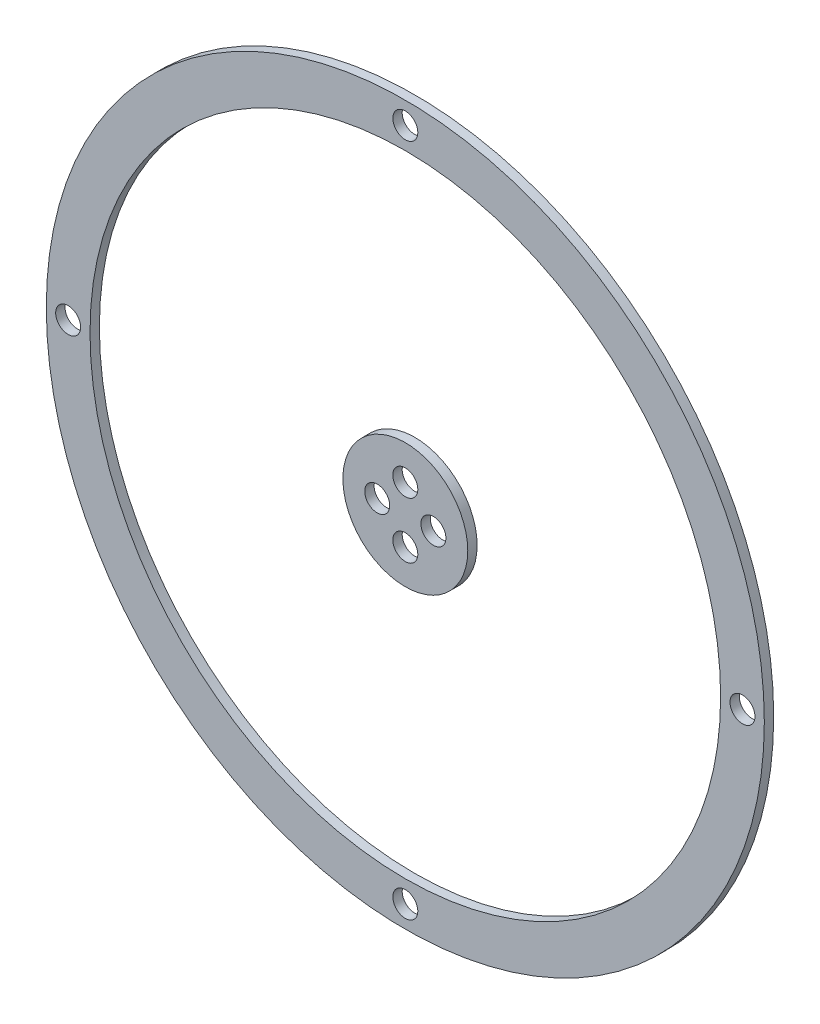
ISO-10303-21;
HEADER;
FILE_DESCRIPTION(('STEP AP214'),'2;1');
FILE_NAME('part.step','',(''),(''),'','','');
FILE_SCHEMA(('AUTOMOTIVE_DESIGN { 1 0 10303 214 1 1 1 1 }'));
ENDSEC;
DATA;
#1=APPLICATION_CONTEXT('core data for automotive mechanical design processes');
#2=APPLICATION_PROTOCOL_DEFINITION('international standard','automotive_design',2000,#1);
#3=PRODUCT_CONTEXT('',#1,'mechanical');
#4=PRODUCT('Part','Part','',(#3));
#5=PRODUCT_RELATED_PRODUCT_CATEGORY('part','',(#4));
#6=PRODUCT_DEFINITION_FORMATION('','',#4);
#7=PRODUCT_DEFINITION_CONTEXT('part definition',#1,'design');
#8=PRODUCT_DEFINITION('design','',#6,#7);
#9=PRODUCT_DEFINITION_SHAPE('','',#8);
#10=(LENGTH_UNIT() NAMED_UNIT(*) SI_UNIT(.MILLI.,.METRE.));
#11=(NAMED_UNIT(*) PLANE_ANGLE_UNIT() SI_UNIT($,.RADIAN.));
#12=(NAMED_UNIT(*) SI_UNIT($,.STERADIAN.) SOLID_ANGLE_UNIT());
#13=UNCERTAINTY_MEASURE_WITH_UNIT(LENGTH_MEASURE(1.E-05),#10,'distance_accuracy_value','');
#14=(GEOMETRIC_REPRESENTATION_CONTEXT(3) GLOBAL_UNCERTAINTY_ASSIGNED_CONTEXT((#13)) GLOBAL_UNIT_ASSIGNED_CONTEXT((#10,
#11,#12)) REPRESENTATION_CONTEXT('',''));
#15=CARTESIAN_POINT('',(0.,0.,0.));
#16=DIRECTION('',(0.,0.,1.));
#17=DIRECTION('',(1.,0.,0.));
#18=AXIS2_PLACEMENT_3D('',#15,#16,#17);
#19=CARTESIAN_POINT('',(0.,4.5,1.5));
#20=DIRECTION('',(0.,0.,-1.));
#21=DIRECTION('',(-1.,0.,0.));
#22=AXIS2_PLACEMENT_3D('',#19,#20,#21);
#23=CYLINDRICAL_SURFACE('',#22,2.);
#24=CARTESIAN_POINT('',(0.,4.5,1.5));
#25=DIRECTION('',(0.,0.,1.));
#26=DIRECTION('',(1.,0.,0.));
#27=AXIS2_PLACEMENT_3D('',#24,#25,#26);
#28=CIRCLE('',#27,2.);
#29=CARTESIAN_POINT('',(2.,4.5,1.5));
#30=VERTEX_POINT('',#29);
#31=EDGE_CURVE('E57',#30,#30,#28,.T.);
#32=ORIENTED_EDGE('',*,*,#31,.T.);
#33=EDGE_LOOP('',(#32));
#34=FACE_BOUND('',#33,.T.);
#35=CARTESIAN_POINT('',(0.,4.5,0.));
#36=DIRECTION('',(0.,0.,1.));
#37=DIRECTION('',(1.,0.,0.));
#38=AXIS2_PLACEMENT_3D('',#35,#36,#37);
#39=CIRCLE('',#38,2.);
#40=CARTESIAN_POINT('',(2.,4.5,0.));
#41=VERTEX_POINT('',#40);
#42=EDGE_CURVE('E74',#41,#41,#39,.T.);
#43=ORIENTED_EDGE('',*,*,#42,.F.);
#44=EDGE_LOOP('',(#43));
#45=FACE_BOUND('',#44,.T.);
#46=ADVANCED_FACE('F49',(#34,#45),#23,.F.);
#47=CARTESIAN_POINT('',(4.5,0.,1.5));
#48=DIRECTION('',(0.,0.,-1.));
#49=DIRECTION('',(-1.,0.,0.));
#50=AXIS2_PLACEMENT_3D('',#47,#48,#49);
#51=CYLINDRICAL_SURFACE('',#50,2.);
#52=CARTESIAN_POINT('',(4.5,0.,1.5));
#53=DIRECTION('',(0.,0.,1.));
#54=DIRECTION('',(1.,0.,0.));
#55=AXIS2_PLACEMENT_3D('',#52,#53,#54);
#56=CIRCLE('',#55,2.);
#57=CARTESIAN_POINT('',(6.5,0.,1.5));
#58=VERTEX_POINT('',#57);
#59=EDGE_CURVE('E62',#58,#58,#56,.T.);
#60=ORIENTED_EDGE('',*,*,#59,.T.);
#61=EDGE_LOOP('',(#60));
#62=FACE_BOUND('',#61,.T.);
#63=CARTESIAN_POINT('',(4.5,0.,0.));
#64=DIRECTION('',(0.,0.,1.));
#65=DIRECTION('',(1.,0.,0.));
#66=AXIS2_PLACEMENT_3D('',#63,#64,#65);
#67=CIRCLE('',#66,2.);
#68=CARTESIAN_POINT('',(6.5,0.,0.));
#69=VERTEX_POINT('',#68);
#70=EDGE_CURVE('E72',#69,#69,#67,.T.);
#71=ORIENTED_EDGE('',*,*,#70,.F.);
#72=EDGE_LOOP('',(#71));
#73=FACE_BOUND('',#72,.T.);
#74=ADVANCED_FACE('F92',(#62,#73),#51,.F.);
#75=CARTESIAN_POINT('',(0.,-4.5,1.5));
#76=DIRECTION('',(0.,0.,-1.));
#77=DIRECTION('',(-1.,0.,0.));
#78=AXIS2_PLACEMENT_3D('',#75,#76,#77);
#79=CYLINDRICAL_SURFACE('',#78,2.);
#80=CARTESIAN_POINT('',(0.,-4.5,1.5));
#81=DIRECTION('',(0.,0.,1.));
#82=DIRECTION('',(1.,0.,0.));
#83=AXIS2_PLACEMENT_3D('',#80,#81,#82);
#84=CIRCLE('',#83,2.);
#85=CARTESIAN_POINT('',(1.99999999999997,-4.5,1.5));
#86=VERTEX_POINT('',#85);
#87=EDGE_CURVE('E83',#86,#86,#84,.T.);
#88=ORIENTED_EDGE('',*,*,#87,.T.);
#89=EDGE_LOOP('',(#88));
#90=FACE_BOUND('',#89,.T.);
#91=CARTESIAN_POINT('',(0.,-4.5,0.));
#92=DIRECTION('',(0.,0.,1.));
#93=DIRECTION('',(1.,0.,0.));
#94=AXIS2_PLACEMENT_3D('',#91,#92,#93);
#95=CIRCLE('',#94,2.);
#96=CARTESIAN_POINT('',(1.99999999999997,-4.5,0.));
#97=VERTEX_POINT('',#96);
#98=EDGE_CURVE('E69',#97,#97,#95,.T.);
#99=ORIENTED_EDGE('',*,*,#98,.F.);
#100=EDGE_LOOP('',(#99));
#101=FACE_BOUND('',#100,.T.);
#102=ADVANCED_FACE('F110',(#90,#101),#79,.F.);
#103=CARTESIAN_POINT('',(-4.5,0.,1.5));
#104=DIRECTION('',(0.,0.,-1.));
#105=DIRECTION('',(-1.,0.,0.));
#106=AXIS2_PLACEMENT_3D('',#103,#104,#105);
#107=CYLINDRICAL_SURFACE('',#106,2.);
#108=CARTESIAN_POINT('',(-4.5,0.,1.5));
#109=DIRECTION('',(0.,0.,1.));
#110=DIRECTION('',(1.,0.,0.));
#111=AXIS2_PLACEMENT_3D('',#108,#109,#110);
#112=CIRCLE('',#111,2.);
#113=CARTESIAN_POINT('',(-2.5,0.,1.5));
#114=VERTEX_POINT('',#113);
#115=EDGE_CURVE('E79',#114,#114,#112,.T.);
#116=ORIENTED_EDGE('',*,*,#115,.T.);
#117=EDGE_LOOP('',(#116));
#118=FACE_BOUND('',#117,.T.);
#119=CARTESIAN_POINT('',(-4.5,0.,0.));
#120=DIRECTION('',(0.,0.,1.));
#121=DIRECTION('',(1.,0.,0.));
#122=AXIS2_PLACEMENT_3D('',#119,#120,#121);
#123=CIRCLE('',#122,2.);
#124=CARTESIAN_POINT('',(-2.5,0.,0.));
#125=VERTEX_POINT('',#124);
#126=EDGE_CURVE('E66',#125,#125,#123,.T.);
#127=ORIENTED_EDGE('',*,*,#126,.F.);
#128=EDGE_LOOP('',(#127));
#129=FACE_BOUND('',#128,.T.);
#130=ADVANCED_FACE('F51',(#118,#129),#107,.F.);
#131=CARTESIAN_POINT('',(0.,0.,1.5));
#132=DIRECTION('',(0.,0.,-1.));
#133=DIRECTION('',(-1.,0.,0.));
#134=AXIS2_PLACEMENT_3D('',#131,#132,#133);
#135=CYLINDRICAL_SURFACE('',#134,10.);
#136=CARTESIAN_POINT('',(0.,0.,1.5));
#137=DIRECTION('',(0.,0.,1.));
#138=DIRECTION('',(1.,0.,0.));
#139=AXIS2_PLACEMENT_3D('',#136,#137,#138);
#140=CIRCLE('',#139,10.);
#141=CARTESIAN_POINT('',(10.,0.,1.5));
#142=VERTEX_POINT('',#141);
#143=EDGE_CURVE('E12',#142,#142,#140,.T.);
#144=ORIENTED_EDGE('',*,*,#143,.F.);
#145=EDGE_LOOP('',(#144));
#146=FACE_BOUND('',#145,.T.);
#147=CARTESIAN_POINT('',(0.,0.,0.));
#148=DIRECTION('',(0.,0.,1.));
#149=DIRECTION('',(1.,0.,0.));
#150=AXIS2_PLACEMENT_3D('',#147,#148,#149);
#151=CIRCLE('',#150,10.);
#152=CARTESIAN_POINT('',(10.,0.,0.));
#153=VERTEX_POINT('',#152);
#154=EDGE_CURVE('E53',#153,#153,#151,.T.);
#155=ORIENTED_EDGE('',*,*,#154,.T.);
#156=EDGE_LOOP('',(#155));
#157=FACE_BOUND('',#156,.T.);
#158=ADVANCED_FACE('F99',(#146,#157),#135,.T.);
#159=CARTESIAN_POINT('',(0.,0.,1.5));
#160=DIRECTION('',(0.,0.,1.));
#161=DIRECTION('',(1.,0.,0.));
#162=AXIS2_PLACEMENT_3D('',#159,#160,#161);
#163=PLANE('',#162);
#164=ORIENTED_EDGE('',*,*,#115,.F.);
#165=EDGE_LOOP('',(#164));
#166=FACE_BOUND('',#165,.T.);
#167=ORIENTED_EDGE('',*,*,#87,.F.);
#168=EDGE_LOOP('',(#167));
#169=FACE_BOUND('',#168,.T.);
#170=ORIENTED_EDGE('',*,*,#59,.F.);
#171=EDGE_LOOP('',(#170));
#172=FACE_BOUND('',#171,.T.);
#173=ORIENTED_EDGE('',*,*,#31,.F.);
#174=EDGE_LOOP('',(#173));
#175=FACE_BOUND('',#174,.T.);
#176=ORIENTED_EDGE('',*,*,#143,.T.);
#177=EDGE_LOOP('',(#176));
#178=FACE_BOUND('',#177,.T.);
#179=ADVANCED_FACE('F95',(#166,#169,#172,#175,#178),#163,.T.);
#180=CARTESIAN_POINT('',(0.,0.,0.));
#181=DIRECTION('',(0.,0.,1.));
#182=DIRECTION('',(1.,0.,0.));
#183=AXIS2_PLACEMENT_3D('',#180,#181,#182);
#184=PLANE('',#183);
#185=ORIENTED_EDGE('',*,*,#126,.T.);
#186=EDGE_LOOP('',(#185));
#187=FACE_BOUND('',#186,.T.);
#188=ORIENTED_EDGE('',*,*,#98,.T.);
#189=EDGE_LOOP('',(#188));
#190=FACE_BOUND('',#189,.T.);
#191=ORIENTED_EDGE('',*,*,#70,.T.);
#192=EDGE_LOOP('',(#191));
#193=FACE_BOUND('',#192,.T.);
#194=ORIENTED_EDGE('',*,*,#42,.T.);
#195=EDGE_LOOP('',(#194));
#196=FACE_BOUND('',#195,.T.);
#197=ORIENTED_EDGE('',*,*,#154,.F.);
#198=EDGE_LOOP('',(#197));
#199=FACE_BOUND('',#198,.T.);
#200=ADVANCED_FACE('F98',(#187,#190,#193,#196,#199),#184,.F.);
#201=CLOSED_SHELL('',(#46,#74,#102,#130,#158,#179,#200));
#202=MANIFOLD_SOLID_BREP('B2',#201);
#203=CARTESIAN_POINT('',(0.,54.,1.5));
#204=DIRECTION('',(0.,0.,-1.));
#205=DIRECTION('',(-1.,0.,0.));
#206=AXIS2_PLACEMENT_3D('',#203,#204,#205);
#207=CYLINDRICAL_SURFACE('',#206,2.);
#208=CARTESIAN_POINT('',(0.,54.,1.5));
#209=DIRECTION('',(0.,0.,1.));
#210=DIRECTION('',(1.,0.,0.));
#211=AXIS2_PLACEMENT_3D('',#208,#209,#210);
#212=CIRCLE('',#211,2.);
#213=CARTESIAN_POINT('',(2.,54.,1.5));
#214=VERTEX_POINT('',#213);
#215=EDGE_CURVE('E196',#214,#214,#212,.T.);
#216=ORIENTED_EDGE('',*,*,#215,.T.);
#217=EDGE_LOOP('',(#216));
#218=FACE_BOUND('',#217,.T.);
#219=CARTESIAN_POINT('',(0.,54.,0.));
#220=DIRECTION('',(0.,0.,1.));
#221=DIRECTION('',(1.,0.,0.));
#222=AXIS2_PLACEMENT_3D('',#219,#220,#221);
#223=CIRCLE('',#222,2.);
#224=CARTESIAN_POINT('',(2.,54.,0.));
#225=VERTEX_POINT('',#224);
#226=EDGE_CURVE('E216',#225,#225,#223,.T.);
#227=ORIENTED_EDGE('',*,*,#226,.F.);
#228=EDGE_LOOP('',(#227));
#229=FACE_BOUND('',#228,.T.);
#230=ADVANCED_FACE('F188',(#218,#229),#207,.F.);
#231=CARTESIAN_POINT('',(0.,0.,1.5));
#232=DIRECTION('',(0.,0.,-1.));
#233=DIRECTION('',(-1.,0.,0.));
#234=AXIS2_PLACEMENT_3D('',#231,#232,#233);
#235=CYLINDRICAL_SURFACE('',#234,50.5);
#236=CARTESIAN_POINT('',(0.,0.,1.5));
#237=DIRECTION('',(0.,0.,1.));
#238=DIRECTION('',(1.,0.,0.));
#239=AXIS2_PLACEMENT_3D('',#236,#237,#238);
#240=CIRCLE('',#239,50.5);
#241=CARTESIAN_POINT('',(50.5,0.,1.5));
#242=VERTEX_POINT('',#241);
#243=EDGE_CURVE('E201',#242,#242,#240,.T.);
#244=ORIENTED_EDGE('',*,*,#243,.T.);
#245=EDGE_LOOP('',(#244));
#246=FACE_BOUND('',#245,.T.);
#247=CARTESIAN_POINT('',(0.,0.,0.));
#248=DIRECTION('',(0.,0.,1.));
#249=DIRECTION('',(1.,0.,0.));
#250=AXIS2_PLACEMENT_3D('',#247,#248,#249);
#251=CIRCLE('',#250,50.5);
#252=CARTESIAN_POINT('',(50.5,0.,0.));
#253=VERTEX_POINT('',#252);
#254=EDGE_CURVE('E214',#253,#253,#251,.T.);
#255=ORIENTED_EDGE('',*,*,#254,.F.);
#256=EDGE_LOOP('',(#255));
#257=FACE_BOUND('',#256,.T.);
#258=ADVANCED_FACE('F237',(#246,#257),#235,.F.);
#259=CARTESIAN_POINT('',(54.0000000000002,0.,1.5));
#260=DIRECTION('',(0.,0.,-1.));
#261=DIRECTION('',(-1.,0.,0.));
#262=AXIS2_PLACEMENT_3D('',#259,#260,#261);
#263=CYLINDRICAL_SURFACE('',#262,2.0000000000001);
#264=CARTESIAN_POINT('',(54.0000000000002,0.,1.5));
#265=DIRECTION('',(0.,0.,1.));
#266=DIRECTION('',(1.,0.,0.));
#267=AXIS2_PLACEMENT_3D('',#264,#265,#266);
#268=CIRCLE('',#267,2.0000000000001);
#269=CARTESIAN_POINT('',(56.0000000000004,0.,1.5));
#270=VERTEX_POINT('',#269);
#271=EDGE_CURVE('E230',#270,#270,#268,.T.);
#272=ORIENTED_EDGE('',*,*,#271,.T.);
#273=EDGE_LOOP('',(#272));
#274=FACE_BOUND('',#273,.T.);
#275=CARTESIAN_POINT('',(54.0000000000002,0.,0.));
#276=DIRECTION('',(0.,0.,1.));
#277=DIRECTION('',(1.,0.,0.));
#278=AXIS2_PLACEMENT_3D('',#275,#276,#277);
#279=CIRCLE('',#278,2.0000000000001);
#280=CARTESIAN_POINT('',(56.0000000000004,0.,0.));
#281=VERTEX_POINT('',#280);
#282=EDGE_CURVE('E211',#281,#281,#279,.T.);
#283=ORIENTED_EDGE('',*,*,#282,.F.);
#284=EDGE_LOOP('',(#283));
#285=FACE_BOUND('',#284,.T.);
#286=ADVANCED_FACE('F255',(#274,#285),#263,.F.);
#287=CARTESIAN_POINT('',(-3.77079984595058E-13,-54.,1.5));
#288=DIRECTION('',(0.,0.,-1.));
#289=DIRECTION('',(-1.,0.,0.));
#290=AXIS2_PLACEMENT_3D('',#287,#288,#289);
#291=CYLINDRICAL_SURFACE('',#290,2.);
#292=CARTESIAN_POINT('',(-3.77079984595058E-13,-54.,1.5));
#293=DIRECTION('',(0.,0.,1.));
#294=DIRECTION('',(1.,0.,0.));
#295=AXIS2_PLACEMENT_3D('',#292,#293,#294);
#296=CIRCLE('',#295,2.);
#297=CARTESIAN_POINT('',(1.99999999999962,-54.,1.5));
#298=VERTEX_POINT('',#297);
#299=EDGE_CURVE('E225',#298,#298,#296,.T.);
#300=ORIENTED_EDGE('',*,*,#299,.T.);
#301=EDGE_LOOP('',(#300));
#302=FACE_BOUND('',#301,.T.);
#303=CARTESIAN_POINT('',(-3.77079984595058E-13,-54.,0.));
#304=DIRECTION('',(0.,0.,1.));
#305=DIRECTION('',(1.,0.,0.));
#306=AXIS2_PLACEMENT_3D('',#303,#304,#305);
#307=CIRCLE('',#306,2.);
#308=CARTESIAN_POINT('',(1.99999999999962,-54.,0.));
#309=VERTEX_POINT('',#308);
#310=EDGE_CURVE('E208',#309,#309,#307,.T.);
#311=ORIENTED_EDGE('',*,*,#310,.F.);
#312=EDGE_LOOP('',(#311));
#313=FACE_BOUND('',#312,.T.);
#314=ADVANCED_FACE('F261',(#302,#313),#291,.F.);
#315=CARTESIAN_POINT('',(-54.,0.,1.5));
#316=DIRECTION('',(0.,0.,-1.));
#317=DIRECTION('',(-1.,0.,0.));
#318=AXIS2_PLACEMENT_3D('',#315,#316,#317);
#319=CYLINDRICAL_SURFACE('',#318,2.00000000000053);
#320=CARTESIAN_POINT('',(-54.,0.,1.5));
#321=DIRECTION('',(0.,0.,1.));
#322=DIRECTION('',(1.,0.,0.));
#323=AXIS2_PLACEMENT_3D('',#320,#321,#322);
#324=CIRCLE('',#323,2.00000000000053);
#325=CARTESIAN_POINT('',(-51.9999999999995,0.,1.5));
#326=VERTEX_POINT('',#325);
#327=EDGE_CURVE('E221',#326,#326,#324,.T.);
#328=ORIENTED_EDGE('',*,*,#327,.T.);
#329=EDGE_LOOP('',(#328));
#330=FACE_BOUND('',#329,.T.);
#331=CARTESIAN_POINT('',(-54.,0.,0.));
#332=DIRECTION('',(0.,0.,1.));
#333=DIRECTION('',(1.,0.,0.));
#334=AXIS2_PLACEMENT_3D('',#331,#332,#333);
#335=CIRCLE('',#334,2.00000000000053);
#336=CARTESIAN_POINT('',(-51.9999999999995,0.,0.));
#337=VERTEX_POINT('',#336);
#338=EDGE_CURVE('E205',#337,#337,#335,.T.);
#339=ORIENTED_EDGE('',*,*,#338,.F.);
#340=EDGE_LOOP('',(#339));
#341=FACE_BOUND('',#340,.T.);
#342=ADVANCED_FACE('F190',(#330,#341),#319,.F.);
#343=CARTESIAN_POINT('',(0.,0.,1.5));
#344=DIRECTION('',(0.,0.,-1.));
#345=DIRECTION('',(-1.,0.,0.));
#346=AXIS2_PLACEMENT_3D('',#343,#344,#345);
#347=CYLINDRICAL_SURFACE('',#346,57.5);
#348=CARTESIAN_POINT('',(0.,0.,1.5));
#349=DIRECTION('',(0.,0.,1.));
#350=DIRECTION('',(1.,0.,0.));
#351=AXIS2_PLACEMENT_3D('',#348,#349,#350);
#352=CIRCLE('',#351,57.5);
#353=CARTESIAN_POINT('',(57.5,0.,1.5));
#354=VERTEX_POINT('',#353);
#355=EDGE_CURVE('E48',#354,#354,#352,.T.);
#356=ORIENTED_EDGE('',*,*,#355,.F.);
#357=EDGE_LOOP('',(#356));
#358=FACE_BOUND('',#357,.T.);
#359=CARTESIAN_POINT('',(0.,0.,0.));
#360=DIRECTION('',(0.,0.,1.));
#361=DIRECTION('',(1.,0.,0.));
#362=AXIS2_PLACEMENT_3D('',#359,#360,#361);
#363=CIRCLE('',#362,57.5);
#364=CARTESIAN_POINT('',(57.5,0.,0.));
#365=VERTEX_POINT('',#364);
#366=EDGE_CURVE('E192',#365,#365,#363,.T.);
#367=ORIENTED_EDGE('',*,*,#366,.T.);
#368=EDGE_LOOP('',(#367));
#369=FACE_BOUND('',#368,.T.);
#370=ADVANCED_FACE('F244',(#358,#369),#347,.T.);
#371=CARTESIAN_POINT('',(0.,0.,1.5));
#372=DIRECTION('',(0.,0.,1.));
#373=DIRECTION('',(1.,0.,0.));
#374=AXIS2_PLACEMENT_3D('',#371,#372,#373);
#375=PLANE('',#374);
#376=ORIENTED_EDGE('',*,*,#327,.F.);
#377=EDGE_LOOP('',(#376));
#378=FACE_BOUND('',#377,.T.);
#379=ORIENTED_EDGE('',*,*,#299,.F.);
#380=EDGE_LOOP('',(#379));
#381=FACE_BOUND('',#380,.T.);
#382=ORIENTED_EDGE('',*,*,#271,.F.);
#383=EDGE_LOOP('',(#382));
#384=FACE_BOUND('',#383,.T.);
#385=ORIENTED_EDGE('',*,*,#243,.F.);
#386=EDGE_LOOP('',(#385));
#387=FACE_BOUND('',#386,.T.);
#388=ORIENTED_EDGE('',*,*,#215,.F.);
#389=EDGE_LOOP('',(#388));
#390=FACE_BOUND('',#389,.T.);
#391=ORIENTED_EDGE('',*,*,#355,.T.);
#392=EDGE_LOOP('',(#391));
#393=FACE_BOUND('',#392,.T.);
#394=ADVANCED_FACE('F240',(#378,#381,#384,#387,#390,#393),#375,.T.);
#395=CARTESIAN_POINT('',(0.,0.,0.));
#396=DIRECTION('',(0.,0.,1.));
#397=DIRECTION('',(1.,0.,0.));
#398=AXIS2_PLACEMENT_3D('',#395,#396,#397);
#399=PLANE('',#398);
#400=ORIENTED_EDGE('',*,*,#338,.T.);
#401=EDGE_LOOP('',(#400));
#402=FACE_BOUND('',#401,.T.);
#403=ORIENTED_EDGE('',*,*,#310,.T.);
#404=EDGE_LOOP('',(#403));
#405=FACE_BOUND('',#404,.T.);
#406=ORIENTED_EDGE('',*,*,#282,.T.);
#407=EDGE_LOOP('',(#406));
#408=FACE_BOUND('',#407,.T.);
#409=ORIENTED_EDGE('',*,*,#254,.T.);
#410=EDGE_LOOP('',(#409));
#411=FACE_BOUND('',#410,.T.);
#412=ORIENTED_EDGE('',*,*,#226,.T.);
#413=EDGE_LOOP('',(#412));
#414=FACE_BOUND('',#413,.T.);
#415=ORIENTED_EDGE('',*,*,#366,.F.);
#416=EDGE_LOOP('',(#415));
#417=FACE_BOUND('',#416,.T.);
#418=ADVANCED_FACE('F243',(#402,#405,#408,#411,#414,#417),#399,.F.);
#419=CLOSED_SHELL('',(#230,#258,#286,#314,#342,#370,#394,#418));
#420=MANIFOLD_SOLID_BREP('B7',#419);
#421=ADVANCED_BREP_SHAPE_REPRESENTATION('',(#18,#202,#420),#14);
#422=SHAPE_DEFINITION_REPRESENTATION(#9,#421);
ENDSEC;
END-ISO-10303-21;
